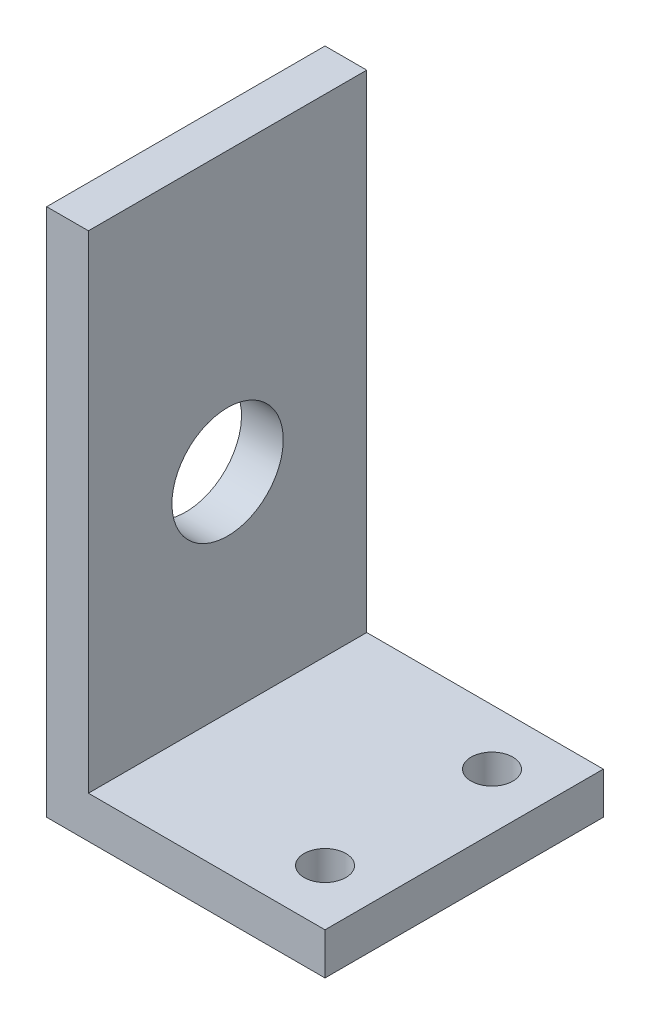
ISO-10303-21;
HEADER;
FILE_DESCRIPTION(('STEP AP214'),'2;1');
FILE_NAME('part.step','',(''),(''),'','','');
FILE_SCHEMA(('AUTOMOTIVE_DESIGN { 1 0 10303 214 1 1 1 1 }'));
ENDSEC;
DATA;
#1=APPLICATION_CONTEXT('core data for automotive mechanical design processes');
#2=APPLICATION_PROTOCOL_DEFINITION('international standard','automotive_design',2000,#1);
#3=PRODUCT_CONTEXT('',#1,'mechanical');
#4=PRODUCT('Part','Part','',(#3));
#5=PRODUCT_RELATED_PRODUCT_CATEGORY('part','',(#4));
#6=PRODUCT_DEFINITION_FORMATION('','',#4);
#7=PRODUCT_DEFINITION_CONTEXT('part definition',#1,'design');
#8=PRODUCT_DEFINITION('design','',#6,#7);
#9=PRODUCT_DEFINITION_SHAPE('','',#8);
#10=(LENGTH_UNIT() NAMED_UNIT(*) SI_UNIT(.MILLI.,.METRE.));
#11=(NAMED_UNIT(*) PLANE_ANGLE_UNIT() SI_UNIT($,.RADIAN.));
#12=(NAMED_UNIT(*) SI_UNIT($,.STERADIAN.) SOLID_ANGLE_UNIT());
#13=UNCERTAINTY_MEASURE_WITH_UNIT(LENGTH_MEASURE(1.E-05),#10,'distance_accuracy_value','');
#14=(GEOMETRIC_REPRESENTATION_CONTEXT(3) GLOBAL_UNCERTAINTY_ASSIGNED_CONTEXT((#13)) GLOBAL_UNIT_ASSIGNED_CONTEXT((#10,
#11,#12)) REPRESENTATION_CONTEXT('',''));
#15=CARTESIAN_POINT('',(0.,0.,0.));
#16=DIRECTION('',(0.,0.,1.));
#17=DIRECTION('',(1.,0.,0.));
#18=AXIS2_PLACEMENT_3D('',#15,#16,#17);
#19=CARTESIAN_POINT('',(20.,0.,20.));
#20=DIRECTION('',(0.,1.,0.));
#21=DIRECTION('',(0.,0.,1.));
#22=AXIS2_PLACEMENT_3D('',#19,#20,#21);
#23=PLANE('',#22);
#24=CARTESIAN_POINT('',(16.,0.,4.));
#25=DIRECTION('',(0.,1.,0.));
#26=DIRECTION('',(0.,0.,1.));
#27=AXIS2_PLACEMENT_3D('',#24,#25,#26);
#28=CIRCLE('',#27,1.5);
#29=CARTESIAN_POINT('',(16.,0.,5.5));
#30=VERTEX_POINT('',#29);
#31=EDGE_CURVE('E162',#30,#30,#28,.T.);
#32=ORIENTED_EDGE('',*,*,#31,.T.);
#33=EDGE_LOOP('',(#32));
#34=FACE_BOUND('',#33,.T.);
#35=CARTESIAN_POINT('',(16.,0.,16.));
#36=DIRECTION('',(0.,1.,0.));
#37=DIRECTION('',(0.,0.,1.));
#38=AXIS2_PLACEMENT_3D('',#35,#36,#37);
#39=CIRCLE('',#38,1.5);
#40=CARTESIAN_POINT('',(16.,0.,17.5));
#41=VERTEX_POINT('',#40);
#42=EDGE_CURVE('E121',#41,#41,#39,.T.);
#43=ORIENTED_EDGE('',*,*,#42,.T.);
#44=EDGE_LOOP('',(#43));
#45=FACE_BOUND('',#44,.T.);
#46=DIRECTION('',(1.,0.,0.));
#47=VECTOR('',#46,1.);
#48=CARTESIAN_POINT('',(20.,0.,0.));
#49=LINE('',#48,#47);
#50=CARTESIAN_POINT('',(0.,0.,0.));
#51=VERTEX_POINT('',#50);
#52=CARTESIAN_POINT('',(20.,0.,0.));
#53=VERTEX_POINT('',#52);
#54=EDGE_CURVE('E117',#51,#53,#49,.T.);
#55=ORIENTED_EDGE('',*,*,#54,.T.);
#56=DIRECTION('',(0.,0.,-1.));
#57=VECTOR('',#56,1.);
#58=CARTESIAN_POINT('',(20.,0.,20.));
#59=LINE('',#58,#57);
#60=CARTESIAN_POINT('',(20.,0.,20.));
#61=VERTEX_POINT('',#60);
#62=EDGE_CURVE('E11',#61,#53,#59,.T.);
#63=ORIENTED_EDGE('',*,*,#62,.F.);
#64=DIRECTION('',(1.,0.,0.));
#65=VECTOR('',#64,1.);
#66=CARTESIAN_POINT('',(20.,0.,20.));
#67=LINE('',#66,#65);
#68=CARTESIAN_POINT('',(0.,0.,20.));
#69=VERTEX_POINT('',#68);
#70=EDGE_CURVE('E128',#69,#61,#67,.T.);
#71=ORIENTED_EDGE('',*,*,#70,.F.);
#72=DIRECTION('',(0.,0.,-1.));
#73=VECTOR('',#72,1.);
#74=CARTESIAN_POINT('',(0.,0.,20.));
#75=LINE('',#74,#73);
#76=EDGE_CURVE('E113',#69,#51,#75,.T.);
#77=ORIENTED_EDGE('',*,*,#76,.T.);
#78=EDGE_LOOP('',(#55,#63,#71,#77));
#79=FACE_BOUND('',#78,.T.);
#80=ADVANCED_FACE('F33',(#34,#45,#79),#23,.F.);
#81=CARTESIAN_POINT('',(20.,3.,20.));
#82=DIRECTION('',(-1.,0.,0.));
#83=DIRECTION('',(0.,-1.,0.));
#84=AXIS2_PLACEMENT_3D('',#81,#82,#83);
#85=PLANE('',#84);
#86=DIRECTION('',(0.,1.,0.));
#87=VECTOR('',#86,1.);
#88=CARTESIAN_POINT('',(20.,3.,0.));
#89=LINE('',#88,#87);
#90=CARTESIAN_POINT('',(20.,3.,0.));
#91=VERTEX_POINT('',#90);
#92=EDGE_CURVE('E120',#53,#91,#89,.T.);
#93=ORIENTED_EDGE('',*,*,#92,.T.);
#94=DIRECTION('',(0.,0.,-1.));
#95=VECTOR('',#94,1.);
#96=CARTESIAN_POINT('',(20.,3.,20.));
#97=LINE('',#96,#95);
#98=CARTESIAN_POINT('',(20.,3.,20.));
#99=VERTEX_POINT('',#98);
#100=EDGE_CURVE('E41',#99,#91,#97,.T.);
#101=ORIENTED_EDGE('',*,*,#100,.F.);
#102=DIRECTION('',(0.,1.,0.));
#103=VECTOR('',#102,1.);
#104=CARTESIAN_POINT('',(20.,3.,20.));
#105=LINE('',#104,#103);
#106=EDGE_CURVE('E86',#61,#99,#105,.T.);
#107=ORIENTED_EDGE('',*,*,#106,.F.);
#108=ORIENTED_EDGE('',*,*,#62,.T.);
#109=EDGE_LOOP('',(#93,#101,#107,#108));
#110=FACE_BOUND('',#109,.T.);
#111=ADVANCED_FACE('F154',(#110),#85,.F.);
#112=CARTESIAN_POINT('',(3.,3.,20.));
#113=DIRECTION('',(0.,-1.,0.));
#114=DIRECTION('',(0.,0.,-1.));
#115=AXIS2_PLACEMENT_3D('',#112,#113,#114);
#116=PLANE('',#115);
#117=CARTESIAN_POINT('',(16.,3.,4.));
#118=DIRECTION('',(0.,1.,0.));
#119=DIRECTION('',(0.,0.,1.));
#120=AXIS2_PLACEMENT_3D('',#117,#118,#119);
#121=CIRCLE('',#120,1.5);
#122=CARTESIAN_POINT('',(16.,3.,5.5));
#123=VERTEX_POINT('',#122);
#124=EDGE_CURVE('E171',#123,#123,#121,.T.);
#125=ORIENTED_EDGE('',*,*,#124,.F.);
#126=EDGE_LOOP('',(#125));
#127=FACE_BOUND('',#126,.T.);
#128=CARTESIAN_POINT('',(16.,3.,16.));
#129=DIRECTION('',(0.,1.,0.));
#130=DIRECTION('',(0.,0.,1.));
#131=AXIS2_PLACEMENT_3D('',#128,#129,#130);
#132=CIRCLE('',#131,1.5);
#133=CARTESIAN_POINT('',(16.,3.,17.5));
#134=VERTEX_POINT('',#133);
#135=EDGE_CURVE('E166',#134,#134,#132,.T.);
#136=ORIENTED_EDGE('',*,*,#135,.F.);
#137=EDGE_LOOP('',(#136));
#138=FACE_BOUND('',#137,.T.);
#139=DIRECTION('',(-1.,0.,0.));
#140=VECTOR('',#139,1.);
#141=CARTESIAN_POINT('',(3.,3.,0.));
#142=LINE('',#141,#140);
#143=CARTESIAN_POINT('',(3.,3.,0.));
#144=VERTEX_POINT('',#143);
#145=EDGE_CURVE('E123',#91,#144,#142,.T.);
#146=ORIENTED_EDGE('',*,*,#145,.T.);
#147=DIRECTION('',(0.,0.,-1.));
#148=VECTOR('',#147,1.);
#149=CARTESIAN_POINT('',(3.,3.,20.));
#150=LINE('',#149,#148);
#151=CARTESIAN_POINT('',(3.,3.,20.));
#152=VERTEX_POINT('',#151);
#153=EDGE_CURVE('E108',#152,#144,#150,.T.);
#154=ORIENTED_EDGE('',*,*,#153,.F.);
#155=DIRECTION('',(-1.,0.,0.));
#156=VECTOR('',#155,1.);
#157=CARTESIAN_POINT('',(3.,3.,20.));
#158=LINE('',#157,#156);
#159=EDGE_CURVE('E99',#99,#152,#158,.T.);
#160=ORIENTED_EDGE('',*,*,#159,.F.);
#161=ORIENTED_EDGE('',*,*,#100,.T.);
#162=EDGE_LOOP('',(#146,#154,#160,#161));
#163=FACE_BOUND('',#162,.T.);
#164=ADVANCED_FACE('F134',(#127,#138,#163),#116,.F.);
#165=CARTESIAN_POINT('',(3.,38.,20.));
#166=DIRECTION('',(-1.,0.,0.));
#167=DIRECTION('',(0.,-1.,0.));
#168=AXIS2_PLACEMENT_3D('',#165,#166,#167);
#169=PLANE('',#168);
#170=CARTESIAN_POINT('',(3.,18.0000000000013,9.99999999999992));
#171=DIRECTION('',(1.,0.,0.));
#172=DIRECTION('',(0.,1.,0.));
#173=AXIS2_PLACEMENT_3D('',#170,#171,#172);
#174=CIRCLE('',#173,3.99999999999949);
#175=CARTESIAN_POINT('',(3.,22.0000000000008,9.99999999999992));
#176=VERTEX_POINT('',#175);
#177=EDGE_CURVE('E178',#176,#176,#174,.T.);
#178=ORIENTED_EDGE('',*,*,#177,.F.);
#179=EDGE_LOOP('',(#178));
#180=FACE_BOUND('',#179,.T.);
#181=DIRECTION('',(0.,1.,0.));
#182=VECTOR('',#181,1.);
#183=CARTESIAN_POINT('',(3.,38.,0.));
#184=LINE('',#183,#182);
#185=CARTESIAN_POINT('',(3.,38.,0.));
#186=VERTEX_POINT('',#185);
#187=EDGE_CURVE('E107',#144,#186,#184,.T.);
#188=ORIENTED_EDGE('',*,*,#187,.T.);
#189=DIRECTION('',(0.,0.,-1.));
#190=VECTOR('',#189,1.);
#191=CARTESIAN_POINT('',(3.,38.,20.));
#192=LINE('',#191,#190);
#193=CARTESIAN_POINT('',(3.,38.,20.));
#194=VERTEX_POINT('',#193);
#195=EDGE_CURVE('E104',#194,#186,#192,.T.);
#196=ORIENTED_EDGE('',*,*,#195,.F.);
#197=DIRECTION('',(0.,1.,0.));
#198=VECTOR('',#197,1.);
#199=CARTESIAN_POINT('',(3.,38.,20.));
#200=LINE('',#199,#198);
#201=EDGE_CURVE('E93',#152,#194,#200,.T.);
#202=ORIENTED_EDGE('',*,*,#201,.F.);
#203=ORIENTED_EDGE('',*,*,#153,.T.);
#204=EDGE_LOOP('',(#188,#196,#202,#203));
#205=FACE_BOUND('',#204,.T.);
#206=ADVANCED_FACE('F105',(#180,#205),#169,.F.);
#207=CARTESIAN_POINT('',(0.,38.,20.));
#208=DIRECTION('',(0.,-1.,0.));
#209=DIRECTION('',(0.,0.,-1.));
#210=AXIS2_PLACEMENT_3D('',#207,#208,#209);
#211=PLANE('',#210);
#212=DIRECTION('',(-1.,0.,0.));
#213=VECTOR('',#212,1.);
#214=CARTESIAN_POINT('',(0.,38.,0.));
#215=LINE('',#214,#213);
#216=CARTESIAN_POINT('',(0.,38.,0.));
#217=VERTEX_POINT('',#216);
#218=EDGE_CURVE('E72',#186,#217,#215,.T.);
#219=ORIENTED_EDGE('',*,*,#218,.T.);
#220=DIRECTION('',(0.,0.,-1.));
#221=VECTOR('',#220,1.);
#222=CARTESIAN_POINT('',(0.,38.,20.));
#223=LINE('',#222,#221);
#224=CARTESIAN_POINT('',(0.,38.,20.));
#225=VERTEX_POINT('',#224);
#226=EDGE_CURVE('E109',#225,#217,#223,.T.);
#227=ORIENTED_EDGE('',*,*,#226,.F.);
#228=DIRECTION('',(-1.,0.,0.));
#229=VECTOR('',#228,1.);
#230=CARTESIAN_POINT('',(0.,38.,20.));
#231=LINE('',#230,#229);
#232=EDGE_CURVE('E97',#194,#225,#231,.T.);
#233=ORIENTED_EDGE('',*,*,#232,.F.);
#234=ORIENTED_EDGE('',*,*,#195,.T.);
#235=EDGE_LOOP('',(#219,#227,#233,#234));
#236=FACE_BOUND('',#235,.T.);
#237=ADVANCED_FACE('F111',(#236),#211,.F.);
#238=CARTESIAN_POINT('',(0.,0.,20.));
#239=DIRECTION('',(1.,0.,0.));
#240=DIRECTION('',(0.,0.,-1.));
#241=AXIS2_PLACEMENT_3D('',#238,#239,#240);
#242=PLANE('',#241);
#243=CARTESIAN_POINT('',(0.,18.0000000000013,9.99999999999992));
#244=DIRECTION('',(1.,0.,0.));
#245=DIRECTION('',(0.,1.,0.));
#246=AXIS2_PLACEMENT_3D('',#243,#244,#245);
#247=CIRCLE('',#246,3.99999999999949);
#248=CARTESIAN_POINT('',(0.,22.0000000000008,9.99999999999992));
#249=VERTEX_POINT('',#248);
#250=EDGE_CURVE('E176',#249,#249,#247,.T.);
#251=ORIENTED_EDGE('',*,*,#250,.T.);
#252=EDGE_LOOP('',(#251));
#253=FACE_BOUND('',#252,.T.);
#254=DIRECTION('',(0.,-1.,0.));
#255=VECTOR('',#254,1.);
#256=CARTESIAN_POINT('',(0.,0.,0.));
#257=LINE('',#256,#255);
#258=EDGE_CURVE('E78',#217,#51,#257,.T.);
#259=ORIENTED_EDGE('',*,*,#258,.T.);
#260=ORIENTED_EDGE('',*,*,#76,.F.);
#261=DIRECTION('',(0.,-1.,0.));
#262=VECTOR('',#261,1.);
#263=CARTESIAN_POINT('',(0.,0.,20.));
#264=LINE('',#263,#262);
#265=EDGE_CURVE('E49',#225,#69,#264,.T.);
#266=ORIENTED_EDGE('',*,*,#265,.F.);
#267=ORIENTED_EDGE('',*,*,#226,.T.);
#268=EDGE_LOOP('',(#259,#260,#266,#267));
#269=FACE_BOUND('',#268,.T.);
#270=ADVANCED_FACE('F141',(#253,#269),#242,.F.);
#271=CARTESIAN_POINT('',(0.,0.,20.));
#272=DIRECTION('',(0.,0.,-1.));
#273=DIRECTION('',(-1.,0.,0.));
#274=AXIS2_PLACEMENT_3D('',#271,#272,#273);
#275=PLANE('',#274);
#276=ORIENTED_EDGE('',*,*,#70,.T.);
#277=ORIENTED_EDGE('',*,*,#106,.T.);
#278=ORIENTED_EDGE('',*,*,#159,.T.);
#279=ORIENTED_EDGE('',*,*,#201,.T.);
#280=ORIENTED_EDGE('',*,*,#232,.T.);
#281=ORIENTED_EDGE('',*,*,#265,.T.);
#282=EDGE_LOOP('',(#276,#277,#278,#279,#280,#281));
#283=FACE_BOUND('',#282,.T.);
#284=ADVANCED_FACE('F95',(#283),#275,.F.);
#285=CARTESIAN_POINT('',(0.,0.,0.));
#286=DIRECTION('',(0.,0.,-1.));
#287=DIRECTION('',(-1.,0.,0.));
#288=AXIS2_PLACEMENT_3D('',#285,#286,#287);
#289=PLANE('',#288);
#290=ORIENTED_EDGE('',*,*,#54,.F.);
#291=ORIENTED_EDGE('',*,*,#258,.F.);
#292=ORIENTED_EDGE('',*,*,#218,.F.);
#293=ORIENTED_EDGE('',*,*,#187,.F.);
#294=ORIENTED_EDGE('',*,*,#145,.F.);
#295=ORIENTED_EDGE('',*,*,#92,.F.);
#296=EDGE_LOOP('',(#290,#291,#292,#293,#294,#295));
#297=FACE_BOUND('',#296,.T.);
#298=ADVANCED_FACE('F137',(#297),#289,.T.);
#299=CARTESIAN_POINT('',(16.,0.,16.));
#300=DIRECTION('',(0.,1.,0.));
#301=DIRECTION('',(0.,0.,1.));
#302=AXIS2_PLACEMENT_3D('',#299,#300,#301);
#303=CYLINDRICAL_SURFACE('',#302,1.5);
#304=ORIENTED_EDGE('',*,*,#42,.F.);
#305=EDGE_LOOP('',(#304));
#306=FACE_BOUND('',#305,.T.);
#307=ORIENTED_EDGE('',*,*,#135,.T.);
#308=EDGE_LOOP('',(#307));
#309=FACE_BOUND('',#308,.T.);
#310=ADVANCED_FACE('F203',(#306,#309),#303,.F.);
#311=CARTESIAN_POINT('',(16.,0.,4.));
#312=DIRECTION('',(0.,1.,0.));
#313=DIRECTION('',(0.,0.,1.));
#314=AXIS2_PLACEMENT_3D('',#311,#312,#313);
#315=CYLINDRICAL_SURFACE('',#314,1.5);
#316=ORIENTED_EDGE('',*,*,#31,.F.);
#317=EDGE_LOOP('',(#316));
#318=FACE_BOUND('',#317,.T.);
#319=ORIENTED_EDGE('',*,*,#124,.T.);
#320=EDGE_LOOP('',(#319));
#321=FACE_BOUND('',#320,.T.);
#322=ADVANCED_FACE('F186',(#318,#321),#315,.F.);
#323=CARTESIAN_POINT('',(0.,18.0000000000013,9.99999999999992));
#324=DIRECTION('',(1.,0.,0.));
#325=DIRECTION('',(0.,1.,0.));
#326=AXIS2_PLACEMENT_3D('',#323,#324,#325);
#327=CYLINDRICAL_SURFACE('',#326,3.99999999999949);
#328=ORIENTED_EDGE('',*,*,#250,.F.);
#329=EDGE_LOOP('',(#328));
#330=FACE_BOUND('',#329,.T.);
#331=ORIENTED_EDGE('',*,*,#177,.T.);
#332=EDGE_LOOP('',(#331));
#333=FACE_BOUND('',#332,.T.);
#334=ADVANCED_FACE('F183',(#330,#333),#327,.F.);
#335=CLOSED_SHELL('',(#80,#111,#164,#206,#237,#270,#284,#298,#310,#322,#334));
#336=MANIFOLD_SOLID_BREP('B2',#335);
#337=ADVANCED_BREP_SHAPE_REPRESENTATION('',(#18,#336),#14);
#338=SHAPE_DEFINITION_REPRESENTATION(#9,#337);
ENDSEC;
END-ISO-10303-21;
